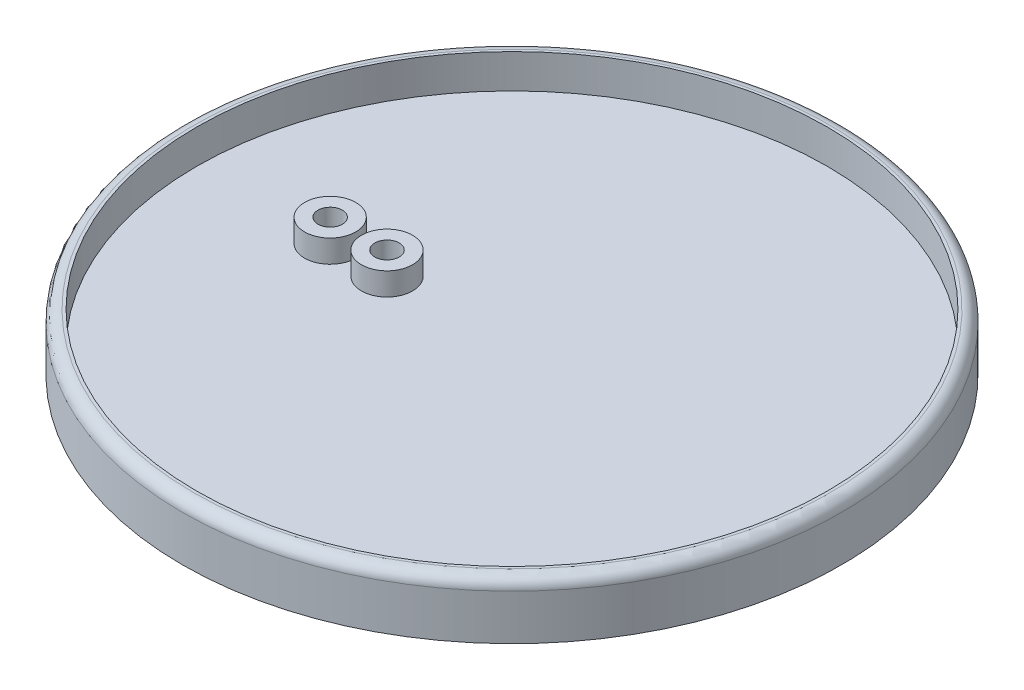
ISO-10303-21;
HEADER;
FILE_DESCRIPTION(('STEP AP214'),'2;1');
FILE_NAME('part.step','',(''),(''),'','','');
FILE_SCHEMA(('AUTOMOTIVE_DESIGN { 1 0 10303 214 1 1 1 1 }'));
ENDSEC;
DATA;
#1=APPLICATION_CONTEXT('core data for automotive mechanical design processes');
#2=APPLICATION_PROTOCOL_DEFINITION('international standard','automotive_design',2000,#1);
#3=PRODUCT_CONTEXT('',#1,'mechanical');
#4=PRODUCT('Part','Part','',(#3));
#5=PRODUCT_RELATED_PRODUCT_CATEGORY('part','',(#4));
#6=PRODUCT_DEFINITION_FORMATION('','',#4);
#7=PRODUCT_DEFINITION_CONTEXT('part definition',#1,'design');
#8=PRODUCT_DEFINITION('design','',#6,#7);
#9=PRODUCT_DEFINITION_SHAPE('','',#8);
#10=(LENGTH_UNIT() NAMED_UNIT(*) SI_UNIT(.MILLI.,.METRE.));
#11=(NAMED_UNIT(*) PLANE_ANGLE_UNIT() SI_UNIT($,.RADIAN.));
#12=(NAMED_UNIT(*) SI_UNIT($,.STERADIAN.) SOLID_ANGLE_UNIT());
#13=UNCERTAINTY_MEASURE_WITH_UNIT(LENGTH_MEASURE(1.E-05),#10,'distance_accuracy_value','');
#14=(GEOMETRIC_REPRESENTATION_CONTEXT(3) GLOBAL_UNCERTAINTY_ASSIGNED_CONTEXT((#13)) GLOBAL_UNIT_ASSIGNED_CONTEXT((#10,
#11,#12)) REPRESENTATION_CONTEXT('',''));
#15=CARTESIAN_POINT('',(0.,0.,0.));
#16=DIRECTION('',(0.,0.,1.));
#17=DIRECTION('',(1.,0.,0.));
#18=AXIS2_PLACEMENT_3D('',#15,#16,#17);
#19=CARTESIAN_POINT('',(0.,4.,0.));
#20=DIRECTION('',(0.,-1.,0.));
#21=DIRECTION('',(0.,0.,-1.));
#22=AXIS2_PLACEMENT_3D('',#19,#20,#21);
#23=CYLINDRICAL_SURFACE('',#22,58.);
#24=CARTESIAN_POINT('',(0.,8.,0.));
#25=DIRECTION('',(0.,1.,0.));
#26=DIRECTION('',(0.,0.,1.));
#27=AXIS2_PLACEMENT_3D('',#24,#25,#26);
#28=CIRCLE('',#27,58.);
#29=CARTESIAN_POINT('',(0.,8.,58.));
#30=VERTEX_POINT('',#29);
#31=EDGE_CURVE('E10',#30,#30,#28,.F.);
#32=ORIENTED_EDGE('',*,*,#31,.T.);
#33=EDGE_LOOP('',(#32));
#34=FACE_BOUND('',#33,.T.);
#35=CARTESIAN_POINT('',(0.,0.,0.));
#36=DIRECTION('',(0.,1.,0.));
#37=DIRECTION('',(0.,0.,1.));
#38=AXIS2_PLACEMENT_3D('',#35,#36,#37);
#39=CIRCLE('',#38,58.);
#40=CARTESIAN_POINT('',(0.,0.,58.));
#41=VERTEX_POINT('',#40);
#42=EDGE_CURVE('E60',#41,#41,#39,.T.);
#43=ORIENTED_EDGE('',*,*,#42,.T.);
#44=EDGE_LOOP('',(#43));
#45=FACE_BOUND('',#44,.T.);
#46=ADVANCED_FACE('F39',(#34,#45),#23,.T.);
#47=CARTESIAN_POINT('',(-22.,0.,0.));
#48=DIRECTION('',(0.,1.,0.));
#49=DIRECTION('',(0.,0.,1.));
#50=AXIS2_PLACEMENT_3D('',#47,#48,#49);
#51=PLANE('',#50);
#52=CARTESIAN_POINT('',(-22.,0.,0.));
#53=DIRECTION('',(0.,1.,0.));
#54=DIRECTION('',(0.,0.,1.));
#55=AXIS2_PLACEMENT_3D('',#52,#53,#54);
#56=CIRCLE('',#55,2.15);
#57=CARTESIAN_POINT('',(-22.,0.,2.15));
#58=VERTEX_POINT('',#57);
#59=EDGE_CURVE('E81',#58,#58,#56,.T.);
#60=ORIENTED_EDGE('',*,*,#59,.T.);
#61=EDGE_LOOP('',(#60));
#62=FACE_BOUND('',#61,.T.);
#63=CARTESIAN_POINT('',(-32.,0.,0.));
#64=DIRECTION('',(0.,1.,0.));
#65=DIRECTION('',(0.,0.,1.));
#66=AXIS2_PLACEMENT_3D('',#63,#64,#65);
#67=CIRCLE('',#66,2.15);
#68=CARTESIAN_POINT('',(-32.,0.,2.15));
#69=VERTEX_POINT('',#68);
#70=EDGE_CURVE('E78',#69,#69,#67,.T.);
#71=ORIENTED_EDGE('',*,*,#70,.T.);
#72=EDGE_LOOP('',(#71));
#73=FACE_BOUND('',#72,.T.);
#74=ORIENTED_EDGE('',*,*,#42,.F.);
#75=EDGE_LOOP('',(#74));
#76=FACE_BOUND('',#75,.T.);
#77=ADVANCED_FACE('F112',(#62,#73,#76),#51,.F.);
#78=CARTESIAN_POINT('',(0.,10.,0.));
#79=DIRECTION('',(0.,1.,0.));
#80=DIRECTION('',(0.,0.,1.));
#81=AXIS2_PLACEMENT_3D('',#78,#79,#80);
#82=PLANE('',#81);
#83=CARTESIAN_POINT('',(0.,10.,0.));
#84=DIRECTION('',(0.,1.,0.));
#85=DIRECTION('',(0.,0.,1.));
#86=AXIS2_PLACEMENT_3D('',#83,#84,#85);
#87=CIRCLE('',#86,56.);
#88=CARTESIAN_POINT('',(0.,10.,56.));
#89=VERTEX_POINT('',#88);
#90=EDGE_CURVE('E46',#89,#89,#87,.T.);
#91=ORIENTED_EDGE('',*,*,#90,.T.);
#92=EDGE_LOOP('',(#91));
#93=FACE_BOUND('',#92,.T.);
#94=CARTESIAN_POINT('',(0.,10.,0.));
#95=DIRECTION('',(0.,1.,0.));
#96=DIRECTION('',(0.,0.,1.));
#97=AXIS2_PLACEMENT_3D('',#94,#95,#96);
#98=CIRCLE('',#97,55.5);
#99=CARTESIAN_POINT('',(0.,10.,55.5));
#100=VERTEX_POINT('',#99);
#101=EDGE_CURVE('E70',#100,#100,#98,.T.);
#102=ORIENTED_EDGE('',*,*,#101,.F.);
#103=EDGE_LOOP('',(#102));
#104=FACE_BOUND('',#103,.T.);
#105=ADVANCED_FACE('F117',(#93,#104),#82,.T.);
#106=CARTESIAN_POINT('',(0.,10.,0.));
#107=DIRECTION('',(0.,-1.,0.));
#108=DIRECTION('',(0.,0.,-1.));
#109=AXIS2_PLACEMENT_3D('',#106,#107,#108);
#110=CYLINDRICAL_SURFACE('',#109,55.5);
#111=CARTESIAN_POINT('',(0.,4.,0.));
#112=DIRECTION('',(0.,1.,0.));
#113=DIRECTION('',(0.,0.,1.));
#114=AXIS2_PLACEMENT_3D('',#111,#112,#113);
#115=CIRCLE('',#114,55.5);
#116=CARTESIAN_POINT('',(0.,4.,55.5));
#117=VERTEX_POINT('',#116);
#118=EDGE_CURVE('E50',#117,#117,#115,.F.);
#119=ORIENTED_EDGE('',*,*,#118,.T.);
#120=EDGE_LOOP('',(#119));
#121=FACE_BOUND('',#120,.T.);
#122=ORIENTED_EDGE('',*,*,#101,.T.);
#123=EDGE_LOOP('',(#122));
#124=FACE_BOUND('',#123,.T.);
#125=ADVANCED_FACE('F123',(#121,#124),#110,.F.);
#126=CARTESIAN_POINT('',(-32.,8.,0.));
#127=DIRECTION('',(0.,1.,0.));
#128=DIRECTION('',(0.,0.,1.));
#129=AXIS2_PLACEMENT_3D('',#126,#127,#128);
#130=PLANE('',#129);
#131=CARTESIAN_POINT('',(-32.,8.,0.));
#132=DIRECTION('',(0.,1.,0.));
#133=DIRECTION('',(0.,0.,1.));
#134=AXIS2_PLACEMENT_3D('',#131,#132,#133);
#135=CIRCLE('',#134,2.15);
#136=CARTESIAN_POINT('',(-32.,8.,2.15));
#137=VERTEX_POINT('',#136);
#138=EDGE_CURVE('E75',#137,#137,#135,.T.);
#139=ORIENTED_EDGE('',*,*,#138,.F.);
#140=EDGE_LOOP('',(#139));
#141=FACE_BOUND('',#140,.T.);
#142=CARTESIAN_POINT('',(-32.,8.,0.));
#143=DIRECTION('',(0.,1.,0.));
#144=DIRECTION('',(0.,0.,1.));
#145=AXIS2_PLACEMENT_3D('',#142,#143,#144);
#146=CIRCLE('',#145,4.5);
#147=CARTESIAN_POINT('',(-32.,8.,4.5));
#148=VERTEX_POINT('',#147);
#149=EDGE_CURVE('E68',#148,#148,#146,.T.);
#150=ORIENTED_EDGE('',*,*,#149,.T.);
#151=EDGE_LOOP('',(#150));
#152=FACE_BOUND('',#151,.T.);
#153=ADVANCED_FACE('F94',(#141,#152),#130,.T.);
#154=CARTESIAN_POINT('',(-22.,8.,0.));
#155=DIRECTION('',(0.,1.,0.));
#156=DIRECTION('',(0.,0.,1.));
#157=AXIS2_PLACEMENT_3D('',#154,#155,#156);
#158=PLANE('',#157);
#159=CARTESIAN_POINT('',(-22.,8.,0.));
#160=DIRECTION('',(0.,1.,0.));
#161=DIRECTION('',(0.,0.,1.));
#162=AXIS2_PLACEMENT_3D('',#159,#160,#161);
#163=CIRCLE('',#162,2.15);
#164=CARTESIAN_POINT('',(-22.,8.,2.15));
#165=VERTEX_POINT('',#164);
#166=EDGE_CURVE('E74',#165,#165,#163,.T.);
#167=ORIENTED_EDGE('',*,*,#166,.F.);
#168=EDGE_LOOP('',(#167));
#169=FACE_BOUND('',#168,.T.);
#170=CARTESIAN_POINT('',(-22.,8.,0.));
#171=DIRECTION('',(0.,1.,0.));
#172=DIRECTION('',(0.,0.,1.));
#173=AXIS2_PLACEMENT_3D('',#170,#171,#172);
#174=CIRCLE('',#173,4.5);
#175=CARTESIAN_POINT('',(-22.,8.,4.5));
#176=VERTEX_POINT('',#175);
#177=EDGE_CURVE('E54',#176,#176,#174,.T.);
#178=ORIENTED_EDGE('',*,*,#177,.T.);
#179=EDGE_LOOP('',(#178));
#180=FACE_BOUND('',#179,.T.);
#181=ADVANCED_FACE('F90',(#169,#180),#158,.T.);
#182=CARTESIAN_POINT('',(-32.,8.,0.));
#183=DIRECTION('',(0.,-1.,0.));
#184=DIRECTION('',(0.,0.,-1.));
#185=AXIS2_PLACEMENT_3D('',#182,#183,#184);
#186=CYLINDRICAL_SURFACE('',#185,4.5);
#187=CARTESIAN_POINT('',(-32.,4.,0.));
#188=DIRECTION('',(0.,1.,0.));
#189=DIRECTION('',(0.,0.,1.));
#190=AXIS2_PLACEMENT_3D('',#187,#188,#189);
#191=CIRCLE('',#190,4.5);
#192=CARTESIAN_POINT('',(-32.,4.,4.5));
#193=VERTEX_POINT('',#192);
#194=EDGE_CURVE('E65',#193,#193,#191,.F.);
#195=ORIENTED_EDGE('',*,*,#194,.F.);
#196=EDGE_LOOP('',(#195));
#197=FACE_BOUND('',#196,.T.);
#198=ORIENTED_EDGE('',*,*,#149,.F.);
#199=EDGE_LOOP('',(#198));
#200=FACE_BOUND('',#199,.T.);
#201=ADVANCED_FACE('F93',(#197,#200),#186,.T.);
#202=CARTESIAN_POINT('',(-22.,8.,0.));
#203=DIRECTION('',(0.,-1.,0.));
#204=DIRECTION('',(0.,0.,-1.));
#205=AXIS2_PLACEMENT_3D('',#202,#203,#204);
#206=CYLINDRICAL_SURFACE('',#205,4.5);
#207=CARTESIAN_POINT('',(-22.,4.,0.));
#208=DIRECTION('',(0.,1.,0.));
#209=DIRECTION('',(0.,0.,1.));
#210=AXIS2_PLACEMENT_3D('',#207,#208,#209);
#211=CIRCLE('',#210,4.5);
#212=CARTESIAN_POINT('',(-22.,4.,4.5));
#213=VERTEX_POINT('',#212);
#214=EDGE_CURVE('E57',#213,#213,#211,.T.);
#215=ORIENTED_EDGE('',*,*,#214,.T.);
#216=EDGE_LOOP('',(#215));
#217=FACE_BOUND('',#216,.T.);
#218=ORIENTED_EDGE('',*,*,#177,.F.);
#219=EDGE_LOOP('',(#218));
#220=FACE_BOUND('',#219,.T.);
#221=ADVANCED_FACE('F98',(#217,#220),#206,.T.);
#222=CARTESIAN_POINT('',(0.,4.,0.));
#223=DIRECTION('',(0.,1.,0.));
#224=DIRECTION('',(0.,0.,1.));
#225=AXIS2_PLACEMENT_3D('',#222,#223,#224);
#226=PLANE('',#225);
#227=ORIENTED_EDGE('',*,*,#214,.F.);
#228=EDGE_LOOP('',(#227));
#229=FACE_BOUND('',#228,.T.);
#230=ORIENTED_EDGE('',*,*,#194,.T.);
#231=EDGE_LOOP('',(#230));
#232=FACE_BOUND('',#231,.T.);
#233=ORIENTED_EDGE('',*,*,#118,.F.);
#234=EDGE_LOOP('',(#233));
#235=FACE_BOUND('',#234,.T.);
#236=ADVANCED_FACE('F100',(#229,#232,#235),#226,.T.);
#237=CARTESIAN_POINT('',(-22.,8.,0.));
#238=DIRECTION('',(0.,-1.,0.));
#239=DIRECTION('',(0.,0.,-1.));
#240=AXIS2_PLACEMENT_3D('',#237,#238,#239);
#241=CYLINDRICAL_SURFACE('',#240,2.15);
#242=ORIENTED_EDGE('',*,*,#166,.T.);
#243=EDGE_LOOP('',(#242));
#244=FACE_BOUND('',#243,.T.);
#245=ORIENTED_EDGE('',*,*,#59,.F.);
#246=EDGE_LOOP('',(#245));
#247=FACE_BOUND('',#246,.T.);
#248=ADVANCED_FACE('F87',(#244,#247),#241,.F.);
#249=CARTESIAN_POINT('',(-32.,8.,0.));
#250=DIRECTION('',(0.,-1.,0.));
#251=DIRECTION('',(0.,0.,-1.));
#252=AXIS2_PLACEMENT_3D('',#249,#250,#251);
#253=CYLINDRICAL_SURFACE('',#252,2.15);
#254=ORIENTED_EDGE('',*,*,#138,.T.);
#255=EDGE_LOOP('',(#254));
#256=FACE_BOUND('',#255,.T.);
#257=ORIENTED_EDGE('',*,*,#70,.F.);
#258=EDGE_LOOP('',(#257));
#259=FACE_BOUND('',#258,.T.);
#260=ADVANCED_FACE('F130',(#256,#259),#253,.F.);
#261=CARTESIAN_POINT('',(0.,8.,0.));
#262=DIRECTION('',(0.,1.,0.));
#263=DIRECTION('',(0.,0.,1.));
#264=AXIS2_PLACEMENT_3D('',#261,#262,#263);
#265=TOROIDAL_SURFACE('',#264,56.,2.);
#266=ORIENTED_EDGE('',*,*,#31,.F.);
#267=EDGE_LOOP('',(#266));
#268=FACE_BOUND('',#267,.T.);
#269=ORIENTED_EDGE('',*,*,#90,.F.);
#270=EDGE_LOOP('',(#269));
#271=FACE_BOUND('',#270,.T.);
#272=ADVANCED_FACE('F41',(#268,#271),#265,.T.);
#273=CLOSED_SHELL('',(#46,#77,#105,#125,#153,#181,#201,#221,#236,#248,#260,#272));
#274=MANIFOLD_SOLID_BREP('B2',#273);
#275=ADVANCED_BREP_SHAPE_REPRESENTATION('',(#18,#274),#14);
#276=SHAPE_DEFINITION_REPRESENTATION(#9,#275);
ENDSEC;
END-ISO-10303-21;
